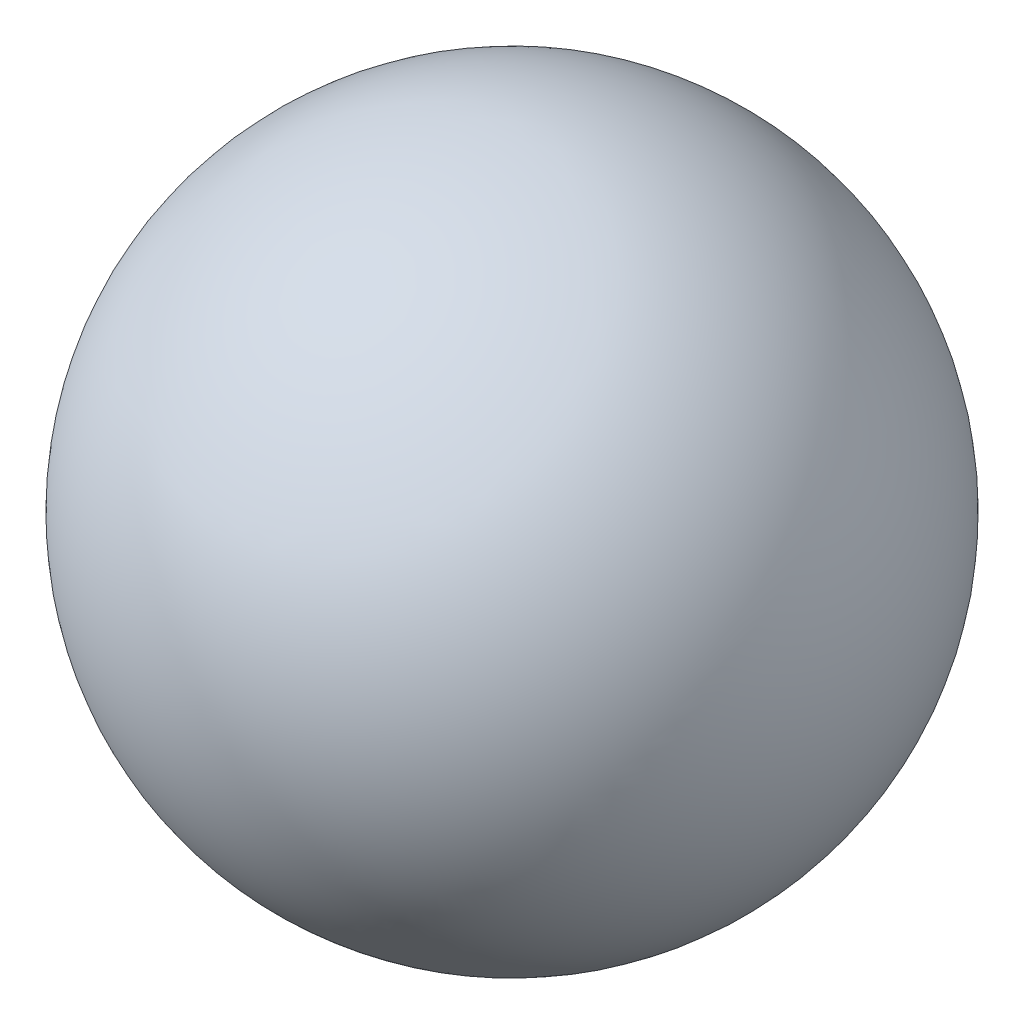
ISO-10303-21;
HEADER;
FILE_DESCRIPTION(('STEP AP214'),'2;1');
FILE_NAME('part.step','',(''),(''),'','','');
FILE_SCHEMA(('AUTOMOTIVE_DESIGN { 1 0 10303 214 1 1 1 1 }'));
ENDSEC;
DATA;
#1=APPLICATION_CONTEXT('core data for automotive mechanical design processes');
#2=APPLICATION_PROTOCOL_DEFINITION('international standard','automotive_design',2000,#1);
#3=PRODUCT_CONTEXT('',#1,'mechanical');
#4=PRODUCT('Part','Part','',(#3));
#5=PRODUCT_RELATED_PRODUCT_CATEGORY('part','',(#4));
#6=PRODUCT_DEFINITION_FORMATION('','',#4);
#7=PRODUCT_DEFINITION_CONTEXT('part definition',#1,'design');
#8=PRODUCT_DEFINITION('design','',#6,#7);
#9=PRODUCT_DEFINITION_SHAPE('','',#8);
#10=(LENGTH_UNIT() NAMED_UNIT(*) SI_UNIT(.MILLI.,.METRE.));
#11=(NAMED_UNIT(*) PLANE_ANGLE_UNIT() SI_UNIT($,.RADIAN.));
#12=(NAMED_UNIT(*) SI_UNIT($,.STERADIAN.) SOLID_ANGLE_UNIT());
#13=UNCERTAINTY_MEASURE_WITH_UNIT(LENGTH_MEASURE(1.E-05),#10,'distance_accuracy_value','');
#14=(GEOMETRIC_REPRESENTATION_CONTEXT(3) GLOBAL_UNCERTAINTY_ASSIGNED_CONTEXT((#13)) GLOBAL_UNIT_ASSIGNED_CONTEXT((#10,
#11,#12)) REPRESENTATION_CONTEXT('',''));
#15=CARTESIAN_POINT('',(0.,0.,0.));
#16=DIRECTION('',(0.,0.,1.));
#17=DIRECTION('',(1.,0.,0.));
#18=AXIS2_PLACEMENT_3D('',#15,#16,#17);
#19=CARTESIAN_POINT('',(0.,0.,0.));
#20=DIRECTION('',(0.538661701668082,0.,0.842522148762896));
#21=DIRECTION('',(-0.842522148762896,0.,0.538661701668082));
#22=AXIS2_PLACEMENT_3D('',#19,#20,#21);
#23=SPHERICAL_SURFACE('',#22,12.7);
#24=CARTESIAN_POINT('',(6.84100361118464,0.,10.7000312892888));
#25=VERTEX_POINT('',#24);
#26=VERTEX_LOOP('',#25);
#27=FACE_BOUND('',#26,.T.);
#28=ADVANCED_FACE('F27',(#27),#23,.T.);
#29=CLOSED_SHELL('',(#28));
#30=CARTESIAN_POINT('',(0.,0.,0.));
#31=DIRECTION('',(0.538661701668082,0.,0.842522148762896));
#32=DIRECTION('',(-0.842522148762896,0.,0.538661701668082));
#33=AXIS2_PLACEMENT_3D('',#30,#31,#32);
#34=SPHERICAL_SURFACE('',#33,11.7);
#35=CARTESIAN_POINT('',(6.30234190951655,0.,9.85750914052588));
#36=VERTEX_POINT('',#35);
#37=VERTEX_LOOP('',#36);
#38=FACE_BOUND('',#37,.T.);
#39=ADVANCED_FACE('F29',(#38),#34,.F.);
#40=CLOSED_SHELL('',(#39));
#41=ORIENTED_CLOSED_SHELL('',*,#40,.T.);
#42=BREP_WITH_VOIDS('B2',#29,(#41));
#43=ADVANCED_BREP_SHAPE_REPRESENTATION('',(#18,#42),#14);
#44=SHAPE_DEFINITION_REPRESENTATION(#9,#43);
ENDSEC;
END-ISO-10303-21;
